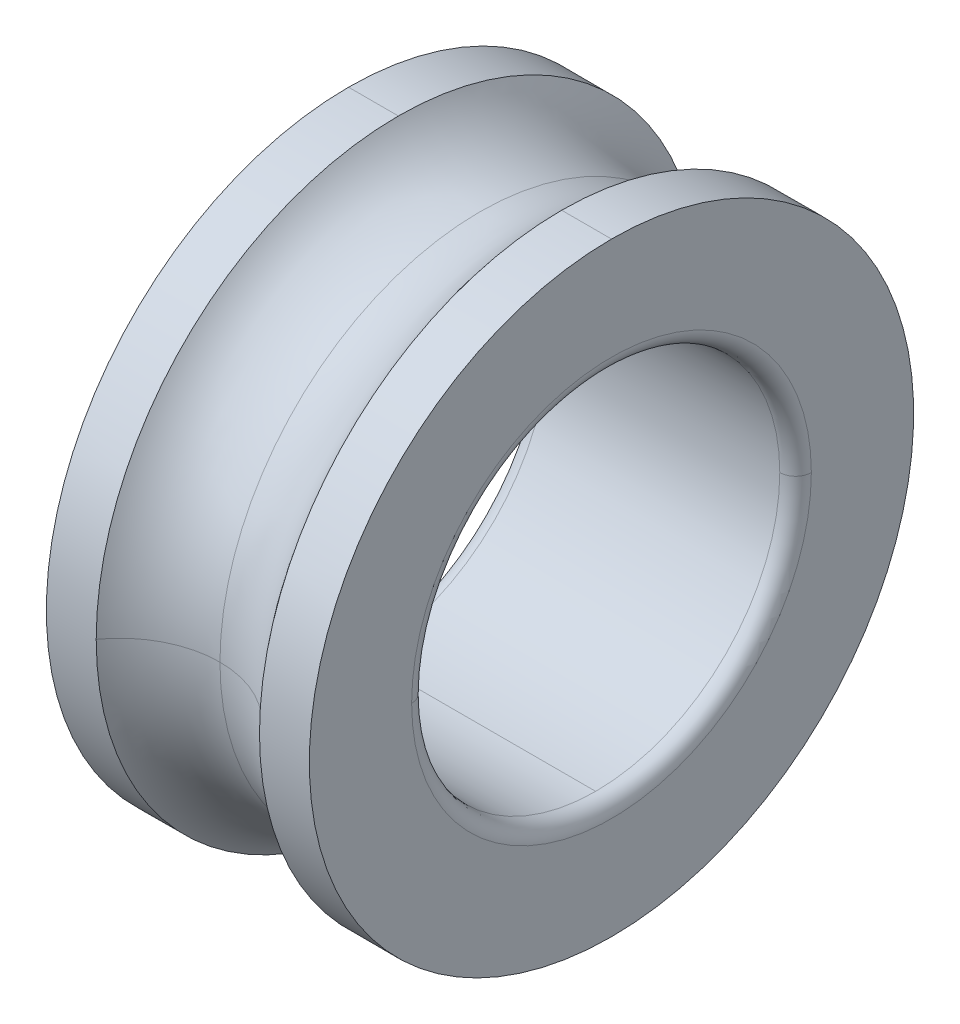
ISO-10303-21;
HEADER;
FILE_DESCRIPTION(('STEP AP214'),'2;1');
FILE_NAME('part.step','',(''),(''),'','','');
FILE_SCHEMA(('AUTOMOTIVE_DESIGN { 1 0 10303 214 1 1 1 1 }'));
ENDSEC;
DATA;
#1=APPLICATION_CONTEXT('core data for automotive mechanical design processes');
#2=APPLICATION_PROTOCOL_DEFINITION('international standard','automotive_design',2000,#1);
#3=PRODUCT_CONTEXT('',#1,'mechanical');
#4=PRODUCT('Part','Part','',(#3));
#5=PRODUCT_RELATED_PRODUCT_CATEGORY('part','',(#4));
#6=PRODUCT_DEFINITION_FORMATION('','',#4);
#7=PRODUCT_DEFINITION_CONTEXT('part definition',#1,'design');
#8=PRODUCT_DEFINITION('design','',#6,#7);
#9=PRODUCT_DEFINITION_SHAPE('','',#8);
#10=(LENGTH_UNIT() NAMED_UNIT(*) SI_UNIT(.MILLI.,.METRE.));
#11=(NAMED_UNIT(*) PLANE_ANGLE_UNIT() SI_UNIT($,.RADIAN.));
#12=(NAMED_UNIT(*) SI_UNIT($,.STERADIAN.) SOLID_ANGLE_UNIT());
#13=UNCERTAINTY_MEASURE_WITH_UNIT(LENGTH_MEASURE(1.E-05),#10,'distance_accuracy_value','');
#14=(GEOMETRIC_REPRESENTATION_CONTEXT(3) GLOBAL_UNCERTAINTY_ASSIGNED_CONTEXT((#13)) GLOBAL_UNIT_ASSIGNED_CONTEXT((#10,
#11,#12)) REPRESENTATION_CONTEXT('',''));
#15=CARTESIAN_POINT('',(0.,0.,0.));
#16=DIRECTION('',(0.,0.,1.));
#17=DIRECTION('',(1.,0.,0.));
#18=AXIS2_PLACEMENT_3D('',#15,#16,#17);
#19=CARTESIAN_POINT('',(22.6305006442468,0.,0.));
#20=DIRECTION('',(1.,0.,0.));
#21=DIRECTION('',(0.,1.,0.));
#22=AXIS2_PLACEMENT_3D('',#19,#20,#21);
#23=CYLINDRICAL_SURFACE('',#22,28.725);
#24=DIRECTION('',(1.,0.,0.));
#25=VECTOR('',#24,1.);
#26=CARTESIAN_POINT('',(22.6305006442468,28.725,0.));
#27=LINE('',#26,#25);
#28=CARTESIAN_POINT('',(20.2610012884936,28.725,0.));
#29=VERTEX_POINT('',#28);
#30=CARTESIAN_POINT('',(25.,28.725,0.));
#31=VERTEX_POINT('',#30);
#32=EDGE_CURVE('E121',#29,#31,#27,.T.);
#33=ORIENTED_EDGE('',*,*,#32,.T.);
#34=CARTESIAN_POINT('',(25.,0.,0.));
#35=DIRECTION('',(1.,0.,0.));
#36=DIRECTION('',(0.,1.,0.));
#37=AXIS2_PLACEMENT_3D('',#34,#35,#36);
#38=CIRCLE('',#37,28.725);
#39=CARTESIAN_POINT('',(25.,-28.725,0.));
#40=VERTEX_POINT('',#39);
#41=EDGE_CURVE('E179',#40,#31,#38,.T.);
#42=ORIENTED_EDGE('',*,*,#41,.F.);
#43=DIRECTION('',(-1.,0.,0.));
#44=VECTOR('',#43,1.);
#45=CARTESIAN_POINT('',(22.6305006442468,-28.725,0.));
#46=LINE('',#45,#44);
#47=CARTESIAN_POINT('',(20.2610012884936,-28.725,0.));
#48=VERTEX_POINT('',#47);
#49=EDGE_CURVE('E146',#40,#48,#46,.T.);
#50=ORIENTED_EDGE('',*,*,#49,.T.);
#51=CARTESIAN_POINT('',(20.2610012884936,0.,0.));
#52=DIRECTION('',(1.,0.,0.));
#53=DIRECTION('',(0.,1.,0.));
#54=AXIS2_PLACEMENT_3D('',#51,#52,#53);
#55=CIRCLE('',#54,28.725);
#56=CARTESIAN_POINT('',(20.2610012884936,0.,-28.725));
#57=VERTEX_POINT('',#56);
#58=EDGE_CURVE('E118',#48,#57,#55,.T.);
#59=ORIENTED_EDGE('',*,*,#58,.T.);
#60=CARTESIAN_POINT('',(20.2610012884936,0.,0.));
#61=DIRECTION('',(1.,0.,0.));
#62=DIRECTION('',(0.,1.,0.));
#63=AXIS2_PLACEMENT_3D('',#60,#61,#62);
#64=CIRCLE('',#63,28.725);
#65=EDGE_CURVE('E131',#57,#29,#64,.T.);
#66=ORIENTED_EDGE('',*,*,#65,.T.);
#67=EDGE_LOOP('',(#33,#42,#50,#59,#66));
#68=FACE_BOUND('',#67,.T.);
#69=ADVANCED_FACE('F16',(#68),#23,.T.);
#70=CARTESIAN_POINT('',(12.5,0.,0.));
#71=DIRECTION('',(1.,0.,0.));
#72=DIRECTION('',(0.,0.,-1.));
#73=AXIS2_PLACEMENT_3D('',#70,#71,#72);
#74=TOROIDAL_SURFACE('',#73,34.247,9.525);
#75=CARTESIAN_POINT('',(12.5,0.,0.));
#76=DIRECTION('',(-1.,0.,0.));
#77=DIRECTION('',(0.,0.,1.));
#78=AXIS2_PLACEMENT_3D('',#75,#76,#77);
#79=CIRCLE('',#78,24.722);
#80=CARTESIAN_POINT('',(12.5,0.,24.722));
#81=VERTEX_POINT('',#80);
#82=CARTESIAN_POINT('',(12.5,0.,-24.722));
#83=VERTEX_POINT('',#82);
#84=EDGE_CURVE('E136',#81,#83,#79,.T.);
#85=ORIENTED_EDGE('',*,*,#84,.T.);
#86=CARTESIAN_POINT('',(12.5,0.,-34.247));
#87=DIRECTION('',(0.,-1.,0.));
#88=DIRECTION('',(0.,0.,-1.));
#89=AXIS2_PLACEMENT_3D('',#86,#87,#88);
#90=CIRCLE('',#89,9.525);
#91=CARTESIAN_POINT('',(4.73899871150635,0.,-28.725));
#92=VERTEX_POINT('',#91);
#93=EDGE_CURVE('E167',#83,#92,#90,.T.);
#94=ORIENTED_EDGE('',*,*,#93,.T.);
#95=CARTESIAN_POINT('',(4.73899871150635,0.,0.));
#96=DIRECTION('',(1.,0.,0.));
#97=DIRECTION('',(0.,1.,0.));
#98=AXIS2_PLACEMENT_3D('',#95,#96,#97);
#99=CIRCLE('',#98,28.725);
#100=CARTESIAN_POINT('',(4.73899871150636,28.725,0.));
#101=VERTEX_POINT('',#100);
#102=EDGE_CURVE('E11',#92,#101,#99,.T.);
#103=ORIENTED_EDGE('',*,*,#102,.T.);
#104=CARTESIAN_POINT('',(4.73899871150635,0.,0.));
#105=DIRECTION('',(1.,0.,0.));
#106=DIRECTION('',(0.,1.,0.));
#107=AXIS2_PLACEMENT_3D('',#104,#105,#106);
#108=CIRCLE('',#107,28.725);
#109=CARTESIAN_POINT('',(4.73899871150635,0.,28.725));
#110=VERTEX_POINT('',#109);
#111=EDGE_CURVE('E178',#101,#110,#108,.T.);
#112=ORIENTED_EDGE('',*,*,#111,.T.);
#113=CARTESIAN_POINT('',(12.5,0.,34.247));
#114=DIRECTION('',(0.,-1.,0.));
#115=DIRECTION('',(0.,0.,1.));
#116=AXIS2_PLACEMENT_3D('',#113,#114,#115);
#117=CIRCLE('',#116,9.525);
#118=EDGE_CURVE('E158',#110,#81,#117,.T.);
#119=ORIENTED_EDGE('',*,*,#118,.T.);
#120=EDGE_LOOP('',(#85,#94,#103,#112,#119));
#121=FACE_BOUND('',#120,.T.);
#122=ADVANCED_FACE('F256',(#121),#74,.F.);
#123=CARTESIAN_POINT('',(2.36949935575318,0.,0.));
#124=DIRECTION('',(1.,0.,0.));
#125=DIRECTION('',(0.,1.,0.));
#126=AXIS2_PLACEMENT_3D('',#123,#124,#125);
#127=CYLINDRICAL_SURFACE('',#126,28.725);
#128=DIRECTION('',(1.,0.,0.));
#129=VECTOR('',#128,1.);
#130=CARTESIAN_POINT('',(2.36949935575318,28.725,0.));
#131=LINE('',#130,#129);
#132=CARTESIAN_POINT('',(0.,28.725,0.));
#133=VERTEX_POINT('',#132);
#134=EDGE_CURVE('E170',#133,#101,#131,.T.);
#135=ORIENTED_EDGE('',*,*,#134,.T.);
#136=ORIENTED_EDGE('',*,*,#102,.F.);
#137=CARTESIAN_POINT('',(4.73899871150635,0.,0.));
#138=DIRECTION('',(1.,0.,0.));
#139=DIRECTION('',(0.,1.,0.));
#140=AXIS2_PLACEMENT_3D('',#137,#138,#139);
#141=CIRCLE('',#140,28.725);
#142=CARTESIAN_POINT('',(4.73899871150635,-28.725,0.));
#143=VERTEX_POINT('',#142);
#144=EDGE_CURVE('E164',#143,#92,#141,.T.);
#145=ORIENTED_EDGE('',*,*,#144,.F.);
#146=DIRECTION('',(-1.,0.,0.));
#147=VECTOR('',#146,1.);
#148=CARTESIAN_POINT('',(2.36949935575318,-28.725,0.));
#149=LINE('',#148,#147);
#150=CARTESIAN_POINT('',(0.,-28.725,0.));
#151=VERTEX_POINT('',#150);
#152=EDGE_CURVE('E174',#143,#151,#149,.T.);
#153=ORIENTED_EDGE('',*,*,#152,.T.);
#154=CARTESIAN_POINT('',(0.,0.,0.));
#155=DIRECTION('',(1.,0.,0.));
#156=DIRECTION('',(0.,1.,0.));
#157=AXIS2_PLACEMENT_3D('',#154,#155,#156);
#158=CIRCLE('',#157,28.725);
#159=EDGE_CURVE('E19',#151,#133,#158,.T.);
#160=ORIENTED_EDGE('',*,*,#159,.T.);
#161=EDGE_LOOP('',(#135,#136,#145,#153,#160));
#162=FACE_BOUND('',#161,.T.);
#163=ADVANCED_FACE('F240',(#162),#127,.T.);
#164=CARTESIAN_POINT('',(0.,23.8625,0.));
#165=DIRECTION('',(-1.,0.,0.));
#166=DIRECTION('',(0.,0.,1.));
#167=AXIS2_PLACEMENT_3D('',#164,#165,#166);
#168=PLANE('',#167);
#169=CARTESIAN_POINT('',(0.,0.,0.));
#170=DIRECTION('',(1.,0.,0.));
#171=DIRECTION('',(0.,1.,0.));
#172=AXIS2_PLACEMENT_3D('',#169,#170,#171);
#173=CIRCLE('',#172,19.);
#174=CARTESIAN_POINT('',(0.,0.,19.));
#175=VERTEX_POINT('',#174);
#176=CARTESIAN_POINT('',(0.,0.,-19.));
#177=VERTEX_POINT('',#176);
#178=EDGE_CURVE('E152',#175,#177,#173,.T.);
#179=ORIENTED_EDGE('',*,*,#178,.T.);
#180=CARTESIAN_POINT('',(0.,0.,0.));
#181=DIRECTION('',(1.,0.,0.));
#182=DIRECTION('',(0.,1.,0.));
#183=AXIS2_PLACEMENT_3D('',#180,#181,#182);
#184=CIRCLE('',#183,19.);
#185=EDGE_CURVE('E195',#177,#175,#184,.T.);
#186=ORIENTED_EDGE('',*,*,#185,.T.);
#187=EDGE_LOOP('',(#179,#186));
#188=FACE_BOUND('',#187,.T.);
#189=CARTESIAN_POINT('',(0.,0.,0.));
#190=DIRECTION('',(1.,0.,0.));
#191=DIRECTION('',(0.,1.,0.));
#192=AXIS2_PLACEMENT_3D('',#189,#190,#191);
#193=CIRCLE('',#192,28.725);
#194=EDGE_CURVE('E171',#133,#151,#193,.T.);
#195=ORIENTED_EDGE('',*,*,#194,.F.);
#196=ORIENTED_EDGE('',*,*,#159,.F.);
#197=EDGE_LOOP('',(#195,#196));
#198=FACE_BOUND('',#197,.T.);
#199=ADVANCED_FACE('F237',(#188,#198),#168,.T.);
#200=CARTESIAN_POINT('',(1.5,0.,0.));
#201=DIRECTION('',(1.,0.,0.));
#202=DIRECTION('',(0.,0.,-1.));
#203=AXIS2_PLACEMENT_3D('',#200,#201,#202);
#204=TOROIDAL_SURFACE('',#203,19.,1.5);
#205=CARTESIAN_POINT('',(1.5,0.,-19.));
#206=DIRECTION('',(0.,-1.,0.));
#207=DIRECTION('',(0.,0.,-1.));
#208=AXIS2_PLACEMENT_3D('',#205,#206,#207);
#209=CIRCLE('',#208,1.5);
#210=CARTESIAN_POINT('',(1.5,0.,-17.5));
#211=VERTEX_POINT('',#210);
#212=EDGE_CURVE('E183',#211,#177,#209,.T.);
#213=ORIENTED_EDGE('',*,*,#212,.T.);
#214=ORIENTED_EDGE('',*,*,#178,.F.);
#215=CARTESIAN_POINT('',(1.5,0.,19.));
#216=DIRECTION('',(0.,-1.,0.));
#217=DIRECTION('',(0.,0.,1.));
#218=AXIS2_PLACEMENT_3D('',#215,#216,#217);
#219=CIRCLE('',#218,1.5);
#220=CARTESIAN_POINT('',(1.5,0.,17.5));
#221=VERTEX_POINT('',#220);
#222=EDGE_CURVE('E192',#175,#221,#219,.T.);
#223=ORIENTED_EDGE('',*,*,#222,.T.);
#224=CARTESIAN_POINT('',(1.5,0.,0.));
#225=DIRECTION('',(1.,0.,0.));
#226=DIRECTION('',(0.,1.,0.));
#227=AXIS2_PLACEMENT_3D('',#224,#225,#226);
#228=CIRCLE('',#227,17.5);
#229=CARTESIAN_POINT('',(1.5,-17.5,0.));
#230=VERTEX_POINT('',#229);
#231=EDGE_CURVE('E150',#221,#230,#228,.T.);
#232=ORIENTED_EDGE('',*,*,#231,.T.);
#233=CARTESIAN_POINT('',(1.5,0.,0.));
#234=DIRECTION('',(1.,0.,0.));
#235=DIRECTION('',(0.,1.,0.));
#236=AXIS2_PLACEMENT_3D('',#233,#234,#235);
#237=CIRCLE('',#236,17.5);
#238=EDGE_CURVE('E201',#230,#211,#237,.T.);
#239=ORIENTED_EDGE('',*,*,#238,.T.);
#240=EDGE_LOOP('',(#213,#214,#223,#232,#239));
#241=FACE_BOUND('',#240,.T.);
#242=ADVANCED_FACE('F230',(#241),#204,.T.);
#243=CARTESIAN_POINT('',(12.5,0.,0.));
#244=DIRECTION('',(1.,0.,0.));
#245=DIRECTION('',(0.,1.,0.));
#246=AXIS2_PLACEMENT_3D('',#243,#244,#245);
#247=CYLINDRICAL_SURFACE('',#246,17.5);
#248=DIRECTION('',(1.,0.,0.));
#249=VECTOR('',#248,1.);
#250=CARTESIAN_POINT('',(12.5,17.5,0.));
#251=LINE('',#250,#249);
#252=CARTESIAN_POINT('',(1.5,17.5,0.));
#253=VERTEX_POINT('',#252);
#254=CARTESIAN_POINT('',(23.5,17.5,0.));
#255=VERTEX_POINT('',#254);
#256=EDGE_CURVE('E198',#253,#255,#251,.T.);
#257=ORIENTED_EDGE('',*,*,#256,.T.);
#258=CARTESIAN_POINT('',(23.5,0.,0.));
#259=DIRECTION('',(1.,0.,0.));
#260=DIRECTION('',(0.,1.,0.));
#261=AXIS2_PLACEMENT_3D('',#258,#259,#260);
#262=CIRCLE('',#261,17.5);
#263=CARTESIAN_POINT('',(23.5,0.,17.5));
#264=VERTEX_POINT('',#263);
#265=EDGE_CURVE('E181',#255,#264,#262,.T.);
#266=ORIENTED_EDGE('',*,*,#265,.T.);
#267=CARTESIAN_POINT('',(23.5,0.,0.));
#268=DIRECTION('',(1.,0.,0.));
#269=DIRECTION('',(0.,1.,0.));
#270=AXIS2_PLACEMENT_3D('',#267,#268,#269);
#271=CIRCLE('',#270,17.5);
#272=CARTESIAN_POINT('',(23.5,-17.5,0.));
#273=VERTEX_POINT('',#272);
#274=EDGE_CURVE('E32',#264,#273,#271,.T.);
#275=ORIENTED_EDGE('',*,*,#274,.T.);
#276=DIRECTION('',(-1.,0.,0.));
#277=VECTOR('',#276,1.);
#278=CARTESIAN_POINT('',(12.5,-17.5,0.));
#279=LINE('',#278,#277);
#280=EDGE_CURVE('E203',#273,#230,#279,.T.);
#281=ORIENTED_EDGE('',*,*,#280,.T.);
#282=ORIENTED_EDGE('',*,*,#231,.F.);
#283=CARTESIAN_POINT('',(1.5,0.,0.));
#284=DIRECTION('',(1.,0.,0.));
#285=DIRECTION('',(0.,1.,0.));
#286=AXIS2_PLACEMENT_3D('',#283,#284,#285);
#287=CIRCLE('',#286,17.5);
#288=EDGE_CURVE('E189',#253,#221,#287,.T.);
#289=ORIENTED_EDGE('',*,*,#288,.F.);
#290=EDGE_LOOP('',(#257,#266,#275,#281,#282,#289));
#291=FACE_BOUND('',#290,.T.);
#292=ADVANCED_FACE('F220',(#291),#247,.F.);
#293=CARTESIAN_POINT('',(23.5,0.,0.));
#294=DIRECTION('',(1.,0.,0.));
#295=DIRECTION('',(0.,0.,-1.));
#296=AXIS2_PLACEMENT_3D('',#293,#294,#295);
#297=TOROIDAL_SURFACE('',#296,19.,1.5);
#298=CARTESIAN_POINT('',(23.5,0.,-19.));
#299=DIRECTION('',(0.,-1.,0.));
#300=DIRECTION('',(0.,0.,-1.));
#301=AXIS2_PLACEMENT_3D('',#298,#299,#300);
#302=CIRCLE('',#301,1.5);
#303=CARTESIAN_POINT('',(25.,0.,-19.));
#304=VERTEX_POINT('',#303);
#305=CARTESIAN_POINT('',(23.5,0.,-17.5));
#306=VERTEX_POINT('',#305);
#307=EDGE_CURVE('E87',#304,#306,#302,.T.);
#308=ORIENTED_EDGE('',*,*,#307,.T.);
#309=CARTESIAN_POINT('',(23.5,0.,0.));
#310=DIRECTION('',(1.,0.,0.));
#311=DIRECTION('',(0.,1.,0.));
#312=AXIS2_PLACEMENT_3D('',#309,#310,#311);
#313=CIRCLE('',#312,17.5);
#314=EDGE_CURVE('E206',#273,#306,#313,.T.);
#315=ORIENTED_EDGE('',*,*,#314,.F.);
#316=ORIENTED_EDGE('',*,*,#274,.F.);
#317=CARTESIAN_POINT('',(23.5,0.,19.));
#318=DIRECTION('',(0.,-1.,0.));
#319=DIRECTION('',(0.,0.,1.));
#320=AXIS2_PLACEMENT_3D('',#317,#318,#319);
#321=CIRCLE('',#320,1.5);
#322=CARTESIAN_POINT('',(25.,0.,19.));
#323=VERTEX_POINT('',#322);
#324=EDGE_CURVE('E216',#264,#323,#321,.T.);
#325=ORIENTED_EDGE('',*,*,#324,.T.);
#326=CARTESIAN_POINT('',(25.,0.,0.));
#327=DIRECTION('',(1.,0.,0.));
#328=DIRECTION('',(0.,1.,0.));
#329=AXIS2_PLACEMENT_3D('',#326,#327,#328);
#330=CIRCLE('',#329,19.);
#331=EDGE_CURVE('E90',#323,#304,#330,.T.);
#332=ORIENTED_EDGE('',*,*,#331,.T.);
#333=EDGE_LOOP('',(#308,#315,#316,#325,#332));
#334=FACE_BOUND('',#333,.T.);
#335=ADVANCED_FACE('F224',(#334),#297,.T.);
#336=CARTESIAN_POINT('',(25.,23.8625,0.));
#337=DIRECTION('',(1.,0.,0.));
#338=DIRECTION('',(0.,1.,0.));
#339=AXIS2_PLACEMENT_3D('',#336,#337,#338);
#340=PLANE('',#339);
#341=CARTESIAN_POINT('',(25.,0.,0.));
#342=DIRECTION('',(1.,0.,0.));
#343=DIRECTION('',(0.,1.,0.));
#344=AXIS2_PLACEMENT_3D('',#341,#342,#343);
#345=CIRCLE('',#344,19.);
#346=EDGE_CURVE('E213',#304,#323,#345,.T.);
#347=ORIENTED_EDGE('',*,*,#346,.F.);
#348=ORIENTED_EDGE('',*,*,#331,.F.);
#349=EDGE_LOOP('',(#347,#348));
#350=FACE_BOUND('',#349,.T.);
#351=CARTESIAN_POINT('',(25.,0.,0.));
#352=DIRECTION('',(1.,0.,0.));
#353=DIRECTION('',(0.,1.,0.));
#354=AXIS2_PLACEMENT_3D('',#351,#352,#353);
#355=CIRCLE('',#354,28.725);
#356=EDGE_CURVE('E149',#31,#40,#355,.T.);
#357=ORIENTED_EDGE('',*,*,#356,.T.);
#358=ORIENTED_EDGE('',*,*,#41,.T.);
#359=EDGE_LOOP('',(#357,#358));
#360=FACE_BOUND('',#359,.T.);
#361=ADVANCED_FACE('F259',(#350,#360),#340,.T.);
#362=CARTESIAN_POINT('',(23.5,0.,0.));
#363=DIRECTION('',(1.,0.,0.));
#364=DIRECTION('',(0.,0.,-1.));
#365=AXIS2_PLACEMENT_3D('',#362,#363,#364);
#366=TOROIDAL_SURFACE('',#365,19.,1.5);
#367=ORIENTED_EDGE('',*,*,#307,.F.);
#368=ORIENTED_EDGE('',*,*,#346,.T.);
#369=ORIENTED_EDGE('',*,*,#324,.F.);
#370=ORIENTED_EDGE('',*,*,#265,.F.);
#371=CARTESIAN_POINT('',(23.5,0.,0.));
#372=DIRECTION('',(1.,0.,0.));
#373=DIRECTION('',(0.,1.,0.));
#374=AXIS2_PLACEMENT_3D('',#371,#372,#373);
#375=CIRCLE('',#374,17.5);
#376=EDGE_CURVE('E209',#306,#255,#375,.T.);
#377=ORIENTED_EDGE('',*,*,#376,.F.);
#378=EDGE_LOOP('',(#367,#368,#369,#370,#377));
#379=FACE_BOUND('',#378,.T.);
#380=ADVANCED_FACE('F261',(#379),#366,.T.);
#381=CARTESIAN_POINT('',(12.5,0.,0.));
#382=DIRECTION('',(1.,0.,0.));
#383=DIRECTION('',(0.,1.,0.));
#384=AXIS2_PLACEMENT_3D('',#381,#382,#383);
#385=CYLINDRICAL_SURFACE('',#384,17.5);
#386=ORIENTED_EDGE('',*,*,#256,.F.);
#387=CARTESIAN_POINT('',(1.5,0.,0.));
#388=DIRECTION('',(1.,0.,0.));
#389=DIRECTION('',(0.,1.,0.));
#390=AXIS2_PLACEMENT_3D('',#387,#388,#389);
#391=CIRCLE('',#390,17.5);
#392=EDGE_CURVE('E186',#211,#253,#391,.T.);
#393=ORIENTED_EDGE('',*,*,#392,.F.);
#394=ORIENTED_EDGE('',*,*,#238,.F.);
#395=ORIENTED_EDGE('',*,*,#280,.F.);
#396=ORIENTED_EDGE('',*,*,#314,.T.);
#397=ORIENTED_EDGE('',*,*,#376,.T.);
#398=EDGE_LOOP('',(#386,#393,#394,#395,#396,#397));
#399=FACE_BOUND('',#398,.T.);
#400=ADVANCED_FACE('F226',(#399),#385,.F.);
#401=CARTESIAN_POINT('',(1.5,0.,0.));
#402=DIRECTION('',(1.,0.,0.));
#403=DIRECTION('',(0.,0.,-1.));
#404=AXIS2_PLACEMENT_3D('',#401,#402,#403);
#405=TOROIDAL_SURFACE('',#404,19.,1.5);
#406=ORIENTED_EDGE('',*,*,#212,.F.);
#407=ORIENTED_EDGE('',*,*,#392,.T.);
#408=ORIENTED_EDGE('',*,*,#288,.T.);
#409=ORIENTED_EDGE('',*,*,#222,.F.);
#410=ORIENTED_EDGE('',*,*,#185,.F.);
#411=EDGE_LOOP('',(#406,#407,#408,#409,#410));
#412=FACE_BOUND('',#411,.T.);
#413=ADVANCED_FACE('F234',(#412),#405,.T.);
#414=CARTESIAN_POINT('',(2.36949935575318,0.,0.));
#415=DIRECTION('',(1.,0.,0.));
#416=DIRECTION('',(0.,1.,0.));
#417=AXIS2_PLACEMENT_3D('',#414,#415,#416);
#418=CYLINDRICAL_SURFACE('',#417,28.725);
#419=ORIENTED_EDGE('',*,*,#134,.F.);
#420=ORIENTED_EDGE('',*,*,#194,.T.);
#421=ORIENTED_EDGE('',*,*,#152,.F.);
#422=CARTESIAN_POINT('',(4.73899871150635,0.,0.));
#423=DIRECTION('',(1.,0.,0.));
#424=DIRECTION('',(0.,1.,0.));
#425=AXIS2_PLACEMENT_3D('',#422,#423,#424);
#426=CIRCLE('',#425,28.725);
#427=EDGE_CURVE('E161',#110,#143,#426,.T.);
#428=ORIENTED_EDGE('',*,*,#427,.F.);
#429=ORIENTED_EDGE('',*,*,#111,.F.);
#430=EDGE_LOOP('',(#419,#420,#421,#428,#429));
#431=FACE_BOUND('',#430,.T.);
#432=ADVANCED_FACE('F248',(#431),#418,.T.);
#433=CARTESIAN_POINT('',(12.5,0.,0.));
#434=DIRECTION('',(1.,0.,0.));
#435=DIRECTION('',(0.,0.,-1.));
#436=AXIS2_PLACEMENT_3D('',#433,#434,#435);
#437=TOROIDAL_SURFACE('',#436,34.247,9.525);
#438=CARTESIAN_POINT('',(12.5,0.,0.));
#439=DIRECTION('',(-1.,0.,0.));
#440=DIRECTION('',(0.,0.,1.));
#441=AXIS2_PLACEMENT_3D('',#438,#439,#440);
#442=CIRCLE('',#441,24.722);
#443=EDGE_CURVE('E141',#83,#81,#442,.T.);
#444=ORIENTED_EDGE('',*,*,#443,.T.);
#445=ORIENTED_EDGE('',*,*,#118,.F.);
#446=ORIENTED_EDGE('',*,*,#427,.T.);
#447=ORIENTED_EDGE('',*,*,#144,.T.);
#448=ORIENTED_EDGE('',*,*,#93,.F.);
#449=EDGE_LOOP('',(#444,#445,#446,#447,#448));
#450=FACE_BOUND('',#449,.T.);
#451=ADVANCED_FACE('F254',(#450),#437,.F.);
#452=CARTESIAN_POINT('',(22.6305006442468,0.,0.));
#453=DIRECTION('',(1.,0.,0.));
#454=DIRECTION('',(0.,1.,0.));
#455=AXIS2_PLACEMENT_3D('',#452,#453,#454);
#456=CYLINDRICAL_SURFACE('',#455,28.725);
#457=ORIENTED_EDGE('',*,*,#32,.F.);
#458=CARTESIAN_POINT('',(20.2610012884936,0.,0.));
#459=DIRECTION('',(1.,0.,0.));
#460=DIRECTION('',(0.,1.,0.));
#461=AXIS2_PLACEMENT_3D('',#458,#459,#460);
#462=CIRCLE('',#461,28.725);
#463=CARTESIAN_POINT('',(20.2610012884936,0.,28.725));
#464=VERTEX_POINT('',#463);
#465=EDGE_CURVE('E124',#29,#464,#462,.T.);
#466=ORIENTED_EDGE('',*,*,#465,.T.);
#467=CARTESIAN_POINT('',(20.2610012884936,0.,0.));
#468=DIRECTION('',(1.,0.,0.));
#469=DIRECTION('',(0.,1.,0.));
#470=AXIS2_PLACEMENT_3D('',#467,#468,#469);
#471=CIRCLE('',#470,28.725);
#472=EDGE_CURVE('E110',#464,#48,#471,.T.);
#473=ORIENTED_EDGE('',*,*,#472,.T.);
#474=ORIENTED_EDGE('',*,*,#49,.F.);
#475=ORIENTED_EDGE('',*,*,#356,.F.);
#476=EDGE_LOOP('',(#457,#466,#473,#474,#475));
#477=FACE_BOUND('',#476,.T.);
#478=ADVANCED_FACE('F125',(#477),#456,.T.);
#479=CARTESIAN_POINT('',(12.5,0.,0.));
#480=DIRECTION('',(1.,0.,0.));
#481=DIRECTION('',(0.,0.,-1.));
#482=AXIS2_PLACEMENT_3D('',#479,#480,#481);
#483=TOROIDAL_SURFACE('',#482,34.247,9.525);
#484=ORIENTED_EDGE('',*,*,#443,.F.);
#485=CARTESIAN_POINT('',(12.5,0.,-34.247));
#486=DIRECTION('',(0.,-1.,0.));
#487=DIRECTION('',(0.,0.,-1.));
#488=AXIS2_PLACEMENT_3D('',#485,#486,#487);
#489=CIRCLE('',#488,9.525);
#490=EDGE_CURVE('E144',#57,#83,#489,.T.);
#491=ORIENTED_EDGE('',*,*,#490,.F.);
#492=ORIENTED_EDGE('',*,*,#58,.F.);
#493=ORIENTED_EDGE('',*,*,#472,.F.);
#494=CARTESIAN_POINT('',(12.5,0.,34.247));
#495=DIRECTION('',(0.,-1.,0.));
#496=DIRECTION('',(0.,0.,1.));
#497=AXIS2_PLACEMENT_3D('',#494,#495,#496);
#498=CIRCLE('',#497,9.525);
#499=EDGE_CURVE('E115',#81,#464,#498,.T.);
#500=ORIENTED_EDGE('',*,*,#499,.F.);
#501=EDGE_LOOP('',(#484,#491,#492,#493,#500));
#502=FACE_BOUND('',#501,.T.);
#503=ADVANCED_FACE('F113',(#502),#483,.F.);
#504=CARTESIAN_POINT('',(12.5,0.,0.));
#505=DIRECTION('',(1.,0.,0.));
#506=DIRECTION('',(0.,0.,-1.));
#507=AXIS2_PLACEMENT_3D('',#504,#505,#506);
#508=TOROIDAL_SURFACE('',#507,34.247,9.525);
#509=ORIENTED_EDGE('',*,*,#84,.F.);
#510=ORIENTED_EDGE('',*,*,#499,.T.);
#511=ORIENTED_EDGE('',*,*,#465,.F.);
#512=ORIENTED_EDGE('',*,*,#65,.F.);
#513=ORIENTED_EDGE('',*,*,#490,.T.);
#514=EDGE_LOOP('',(#509,#510,#511,#512,#513));
#515=FACE_BOUND('',#514,.T.);
#516=ADVANCED_FACE('F133',(#515),#508,.F.);
#517=CLOSED_SHELL('',(#69,#122,#163,#199,#242,#292,#335,#361,#380,#400,#413,#432,#451,#478,#503,#516));
#518=MANIFOLD_SOLID_BREP('B1',#517);
#519=ADVANCED_BREP_SHAPE_REPRESENTATION('',(#18,#518),#14);
#520=SHAPE_DEFINITION_REPRESENTATION(#9,#519);
ENDSEC;
END-ISO-10303-21;
